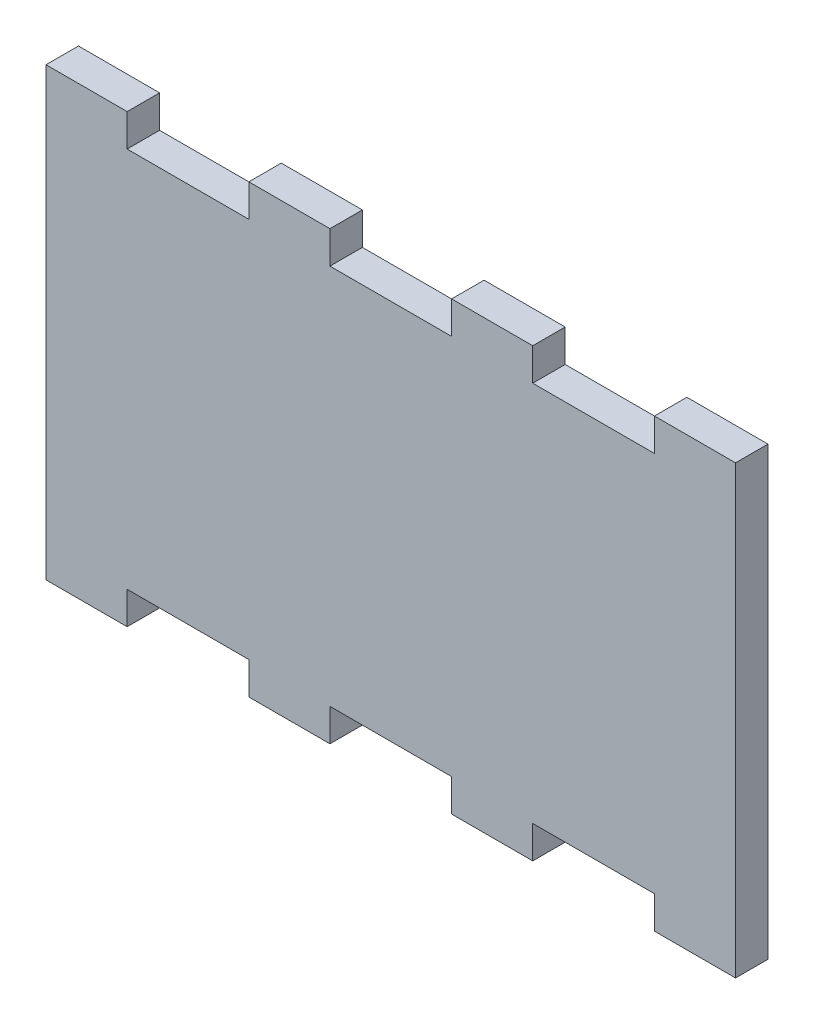
ISO-10303-21;
HEADER;
FILE_DESCRIPTION(('STEP AP214'),'2;1');
FILE_NAME('part.step','',(''),(''),'','','');
FILE_SCHEMA(('AUTOMOTIVE_DESIGN { 1 0 10303 214 1 1 1 1 }'));
ENDSEC;
DATA;
#1=APPLICATION_CONTEXT('core data for automotive mechanical design processes');
#2=APPLICATION_PROTOCOL_DEFINITION('international standard','automotive_design',2000,#1);
#3=PRODUCT_CONTEXT('',#1,'mechanical');
#4=PRODUCT('Part','Part','',(#3));
#5=PRODUCT_RELATED_PRODUCT_CATEGORY('part','',(#4));
#6=PRODUCT_DEFINITION_FORMATION('','',#4);
#7=PRODUCT_DEFINITION_CONTEXT('part definition',#1,'design');
#8=PRODUCT_DEFINITION('design','',#6,#7);
#9=PRODUCT_DEFINITION_SHAPE('','',#8);
#10=(LENGTH_UNIT() NAMED_UNIT(*) SI_UNIT(.MILLI.,.METRE.));
#11=(NAMED_UNIT(*) PLANE_ANGLE_UNIT() SI_UNIT($,.RADIAN.));
#12=(NAMED_UNIT(*) SI_UNIT($,.STERADIAN.) SOLID_ANGLE_UNIT());
#13=UNCERTAINTY_MEASURE_WITH_UNIT(LENGTH_MEASURE(1.E-05),#10,'distance_accuracy_value','');
#14=(GEOMETRIC_REPRESENTATION_CONTEXT(3) GLOBAL_UNCERTAINTY_ASSIGNED_CONTEXT((#13)) GLOBAL_UNIT_ASSIGNED_CONTEXT((#10,
#11,#12)) REPRESENTATION_CONTEXT('',''));
#15=CARTESIAN_POINT('',(0.,0.,0.));
#16=DIRECTION('',(0.,0.,1.));
#17=DIRECTION('',(1.,0.,0.));
#18=AXIS2_PLACEMENT_3D('',#15,#16,#17);
#19=CARTESIAN_POINT('',(0.,0.,4.));
#20=DIRECTION('',(1.,0.,0.));
#21=DIRECTION('',(0.,1.,0.));
#22=AXIS2_PLACEMENT_3D('',#19,#20,#21);
#23=PLANE('',#22);
#24=DIRECTION('',(0.,-1.,0.));
#25=VECTOR('',#24,1.);
#26=CARTESIAN_POINT('',(0.,0.,0.));
#27=LINE('',#26,#25);
#28=CARTESIAN_POINT('',(0.,55.,0.));
#29=VERTEX_POINT('',#28);
#30=CARTESIAN_POINT('',(0.,0.,0.));
#31=VERTEX_POINT('',#30);
#32=EDGE_CURVE('E252',#29,#31,#27,.T.);
#33=ORIENTED_EDGE('',*,*,#32,.T.);
#34=DIRECTION('',(0.,0.,-1.));
#35=VECTOR('',#34,1.);
#36=CARTESIAN_POINT('',(0.,0.,4.));
#37=LINE('',#36,#35);
#38=CARTESIAN_POINT('',(0.,0.,4.));
#39=VERTEX_POINT('',#38);
#40=EDGE_CURVE('E11',#39,#31,#37,.T.);
#41=ORIENTED_EDGE('',*,*,#40,.F.);
#42=DIRECTION('',(0.,-1.,0.));
#43=VECTOR('',#42,1.);
#44=CARTESIAN_POINT('',(0.,0.,4.));
#45=LINE('',#44,#43);
#46=CARTESIAN_POINT('',(0.,55.,4.));
#47=VERTEX_POINT('',#46);
#48=EDGE_CURVE('E306',#47,#39,#45,.T.);
#49=ORIENTED_EDGE('',*,*,#48,.F.);
#50=DIRECTION('',(0.,0.,-1.));
#51=VECTOR('',#50,1.);
#52=CARTESIAN_POINT('',(0.,55.,4.));
#53=LINE('',#52,#51);
#54=EDGE_CURVE('E248',#47,#29,#53,.T.);
#55=ORIENTED_EDGE('',*,*,#54,.T.);
#56=EDGE_LOOP('',(#33,#41,#49,#55));
#57=FACE_BOUND('',#56,.T.);
#58=ADVANCED_FACE('F36',(#57),#23,.F.);
#59=CARTESIAN_POINT('',(0.,0.,4.));
#60=DIRECTION('',(0.,1.,0.));
#61=DIRECTION('',(0.,0.,1.));
#62=AXIS2_PLACEMENT_3D('',#59,#60,#61);
#63=PLANE('',#62);
#64=DIRECTION('',(1.,0.,0.));
#65=VECTOR('',#64,1.);
#66=CARTESIAN_POINT('',(0.,0.,0.));
#67=LINE('',#66,#65);
#68=CARTESIAN_POINT('',(10.,0.,0.));
#69=VERTEX_POINT('',#68);
#70=EDGE_CURVE('E255',#31,#69,#67,.T.);
#71=ORIENTED_EDGE('',*,*,#70,.T.);
#72=DIRECTION('',(0.,0.,-1.));
#73=VECTOR('',#72,1.);
#74=CARTESIAN_POINT('',(10.,0.,4.));
#75=LINE('',#74,#73);
#76=CARTESIAN_POINT('',(10.,0.,4.));
#77=VERTEX_POINT('',#76);
#78=EDGE_CURVE('E44',#77,#69,#75,.T.);
#79=ORIENTED_EDGE('',*,*,#78,.F.);
#80=DIRECTION('',(1.,0.,0.));
#81=VECTOR('',#80,1.);
#82=CARTESIAN_POINT('',(0.,0.,4.));
#83=LINE('',#82,#81);
#84=EDGE_CURVE('E155',#39,#77,#83,.T.);
#85=ORIENTED_EDGE('',*,*,#84,.F.);
#86=ORIENTED_EDGE('',*,*,#40,.T.);
#87=EDGE_LOOP('',(#71,#79,#85,#86));
#88=FACE_BOUND('',#87,.T.);
#89=ADVANCED_FACE('F464',(#88),#63,.F.);
#90=CARTESIAN_POINT('',(10.,0.,4.));
#91=DIRECTION('',(-1.,0.,0.));
#92=DIRECTION('',(0.,-1.,0.));
#93=AXIS2_PLACEMENT_3D('',#90,#91,#92);
#94=PLANE('',#93);
#95=DIRECTION('',(0.,1.,0.));
#96=VECTOR('',#95,1.);
#97=CARTESIAN_POINT('',(10.,0.,0.));
#98=LINE('',#97,#96);
#99=CARTESIAN_POINT('',(10.,4.,0.));
#100=VERTEX_POINT('',#99);
#101=EDGE_CURVE('E257',#69,#100,#98,.T.);
#102=ORIENTED_EDGE('',*,*,#101,.T.);
#103=DIRECTION('',(0.,0.,-1.));
#104=VECTOR('',#103,1.);
#105=CARTESIAN_POINT('',(10.,4.,4.));
#106=LINE('',#105,#104);
#107=CARTESIAN_POINT('',(10.,4.,4.));
#108=VERTEX_POINT('',#107);
#109=EDGE_CURVE('E373',#108,#100,#106,.T.);
#110=ORIENTED_EDGE('',*,*,#109,.F.);
#111=DIRECTION('',(0.,1.,0.));
#112=VECTOR('',#111,1.);
#113=CARTESIAN_POINT('',(10.,0.,4.));
#114=LINE('',#113,#112);
#115=EDGE_CURVE('E381',#77,#108,#114,.T.);
#116=ORIENTED_EDGE('',*,*,#115,.F.);
#117=ORIENTED_EDGE('',*,*,#78,.T.);
#118=EDGE_LOOP('',(#102,#110,#116,#117));
#119=FACE_BOUND('',#118,.T.);
#120=ADVANCED_FACE('F379',(#119),#94,.F.);
#121=CARTESIAN_POINT('',(10.,4.,4.));
#122=DIRECTION('',(0.,1.,0.));
#123=DIRECTION('',(0.,0.,1.));
#124=AXIS2_PLACEMENT_3D('',#121,#122,#123);
#125=PLANE('',#124);
#126=DIRECTION('',(1.,0.,0.));
#127=VECTOR('',#126,1.);
#128=CARTESIAN_POINT('',(10.,4.,0.));
#129=LINE('',#128,#127);
#130=CARTESIAN_POINT('',(25.,4.,0.));
#131=VERTEX_POINT('',#130);
#132=EDGE_CURVE('E259',#100,#131,#129,.T.);
#133=ORIENTED_EDGE('',*,*,#132,.T.);
#134=DIRECTION('',(0.,0.,-1.));
#135=VECTOR('',#134,1.);
#136=CARTESIAN_POINT('',(25.,4.,4.));
#137=LINE('',#136,#135);
#138=CARTESIAN_POINT('',(25.,4.,4.));
#139=VERTEX_POINT('',#138);
#140=EDGE_CURVE('E370',#139,#131,#137,.T.);
#141=ORIENTED_EDGE('',*,*,#140,.F.);
#142=DIRECTION('',(1.,0.,0.));
#143=VECTOR('',#142,1.);
#144=CARTESIAN_POINT('',(10.,4.,4.));
#145=LINE('',#144,#143);
#146=EDGE_CURVE('E399',#108,#139,#145,.T.);
#147=ORIENTED_EDGE('',*,*,#146,.F.);
#148=ORIENTED_EDGE('',*,*,#109,.T.);
#149=EDGE_LOOP('',(#133,#141,#147,#148));
#150=FACE_BOUND('',#149,.T.);
#151=ADVANCED_FACE('F390',(#150),#125,.F.);
#152=CARTESIAN_POINT('',(25.,4.,4.));
#153=DIRECTION('',(1.,0.,0.));
#154=DIRECTION('',(0.,0.,-1.));
#155=AXIS2_PLACEMENT_3D('',#152,#153,#154);
#156=PLANE('',#155);
#157=DIRECTION('',(0.,-1.,0.));
#158=VECTOR('',#157,1.);
#159=CARTESIAN_POINT('',(25.,4.,0.));
#160=LINE('',#159,#158);
#161=CARTESIAN_POINT('',(25.,0.,0.));
#162=VERTEX_POINT('',#161);
#163=EDGE_CURVE('E261',#131,#162,#160,.T.);
#164=ORIENTED_EDGE('',*,*,#163,.T.);
#165=DIRECTION('',(0.,0.,-1.));
#166=VECTOR('',#165,1.);
#167=CARTESIAN_POINT('',(25.,0.,4.));
#168=LINE('',#167,#166);
#169=CARTESIAN_POINT('',(25.,0.,4.));
#170=VERTEX_POINT('',#169);
#171=EDGE_CURVE('E367',#170,#162,#168,.T.);
#172=ORIENTED_EDGE('',*,*,#171,.F.);
#173=DIRECTION('',(0.,-1.,0.));
#174=VECTOR('',#173,1.);
#175=CARTESIAN_POINT('',(25.,4.,4.));
#176=LINE('',#175,#174);
#177=EDGE_CURVE('E396',#139,#170,#176,.T.);
#178=ORIENTED_EDGE('',*,*,#177,.F.);
#179=ORIENTED_EDGE('',*,*,#140,.T.);
#180=EDGE_LOOP('',(#164,#172,#178,#179));
#181=FACE_BOUND('',#180,.T.);
#182=ADVANCED_FACE('F394',(#181),#156,.F.);
#183=CARTESIAN_POINT('',(25.,0.,4.));
#184=DIRECTION('',(0.,1.,0.));
#185=DIRECTION('',(-1.,0.,0.));
#186=AXIS2_PLACEMENT_3D('',#183,#184,#185);
#187=PLANE('',#186);
#188=DIRECTION('',(1.,0.,0.));
#189=VECTOR('',#188,1.);
#190=CARTESIAN_POINT('',(25.,0.,0.));
#191=LINE('',#190,#189);
#192=CARTESIAN_POINT('',(35.,0.,0.));
#193=VERTEX_POINT('',#192);
#194=EDGE_CURVE('E263',#162,#193,#191,.T.);
#195=ORIENTED_EDGE('',*,*,#194,.T.);
#196=DIRECTION('',(0.,0.,-1.));
#197=VECTOR('',#196,1.);
#198=CARTESIAN_POINT('',(35.,0.,4.));
#199=LINE('',#198,#197);
#200=CARTESIAN_POINT('',(35.,0.,4.));
#201=VERTEX_POINT('',#200);
#202=EDGE_CURVE('E364',#201,#193,#199,.T.);
#203=ORIENTED_EDGE('',*,*,#202,.F.);
#204=DIRECTION('',(1.,0.,0.));
#205=VECTOR('',#204,1.);
#206=CARTESIAN_POINT('',(25.,0.,4.));
#207=LINE('',#206,#205);
#208=EDGE_CURVE('E398',#170,#201,#207,.T.);
#209=ORIENTED_EDGE('',*,*,#208,.F.);
#210=ORIENTED_EDGE('',*,*,#171,.T.);
#211=EDGE_LOOP('',(#195,#203,#209,#210));
#212=FACE_BOUND('',#211,.T.);
#213=ADVANCED_FACE('F477',(#212),#187,.F.);
#214=CARTESIAN_POINT('',(35.,0.,4.));
#215=DIRECTION('',(-1.,0.,0.));
#216=DIRECTION('',(0.,0.,1.));
#217=AXIS2_PLACEMENT_3D('',#214,#215,#216);
#218=PLANE('',#217);
#219=DIRECTION('',(0.,1.,0.));
#220=VECTOR('',#219,1.);
#221=CARTESIAN_POINT('',(35.,0.,0.));
#222=LINE('',#221,#220);
#223=CARTESIAN_POINT('',(35.,3.99999999999999,0.));
#224=VERTEX_POINT('',#223);
#225=EDGE_CURVE('E265',#193,#224,#222,.T.);
#226=ORIENTED_EDGE('',*,*,#225,.T.);
#227=DIRECTION('',(0.,0.,-1.));
#228=VECTOR('',#227,1.);
#229=CARTESIAN_POINT('',(35.,3.99999999999999,4.));
#230=LINE('',#229,#228);
#231=CARTESIAN_POINT('',(35.,3.99999999999999,4.));
#232=VERTEX_POINT('',#231);
#233=EDGE_CURVE('E361',#232,#224,#230,.T.);
#234=ORIENTED_EDGE('',*,*,#233,.F.);
#235=DIRECTION('',(0.,1.,0.));
#236=VECTOR('',#235,1.);
#237=CARTESIAN_POINT('',(35.,0.,4.));
#238=LINE('',#237,#236);
#239=EDGE_CURVE('E401',#201,#232,#238,.T.);
#240=ORIENTED_EDGE('',*,*,#239,.F.);
#241=ORIENTED_EDGE('',*,*,#202,.T.);
#242=EDGE_LOOP('',(#226,#234,#240,#241));
#243=FACE_BOUND('',#242,.T.);
#244=ADVANCED_FACE('F480',(#243),#218,.F.);
#245=CARTESIAN_POINT('',(35.,3.99999999999999,4.));
#246=DIRECTION('',(0.,1.,0.));
#247=DIRECTION('',(-1.,0.,0.));
#248=AXIS2_PLACEMENT_3D('',#245,#246,#247);
#249=PLANE('',#248);
#250=DIRECTION('',(1.,0.,0.));
#251=VECTOR('',#250,1.);
#252=CARTESIAN_POINT('',(35.,3.99999999999999,0.));
#253=LINE('',#252,#251);
#254=CARTESIAN_POINT('',(50.,3.99999999999999,0.));
#255=VERTEX_POINT('',#254);
#256=EDGE_CURVE('E267',#224,#255,#253,.T.);
#257=ORIENTED_EDGE('',*,*,#256,.T.);
#258=DIRECTION('',(0.,0.,-1.));
#259=VECTOR('',#258,1.);
#260=CARTESIAN_POINT('',(50.,3.99999999999999,4.));
#261=LINE('',#260,#259);
#262=CARTESIAN_POINT('',(50.,3.99999999999999,4.));
#263=VERTEX_POINT('',#262);
#264=EDGE_CURVE('E358',#263,#255,#261,.T.);
#265=ORIENTED_EDGE('',*,*,#264,.F.);
#266=DIRECTION('',(1.,0.,0.));
#267=VECTOR('',#266,1.);
#268=CARTESIAN_POINT('',(35.,3.99999999999999,4.));
#269=LINE('',#268,#267);
#270=EDGE_CURVE('E407',#232,#263,#269,.T.);
#271=ORIENTED_EDGE('',*,*,#270,.F.);
#272=ORIENTED_EDGE('',*,*,#233,.T.);
#273=EDGE_LOOP('',(#257,#265,#271,#272));
#274=FACE_BOUND('',#273,.T.);
#275=ADVANCED_FACE('F484',(#274),#249,.F.);
#276=CARTESIAN_POINT('',(50.,3.99999999999999,4.));
#277=DIRECTION('',(1.,0.,0.));
#278=DIRECTION('',(0.,0.,-1.));
#279=AXIS2_PLACEMENT_3D('',#276,#277,#278);
#280=PLANE('',#279);
#281=DIRECTION('',(0.,-1.,0.));
#282=VECTOR('',#281,1.);
#283=CARTESIAN_POINT('',(50.,3.99999999999999,0.));
#284=LINE('',#283,#282);
#285=CARTESIAN_POINT('',(50.,0.,0.));
#286=VERTEX_POINT('',#285);
#287=EDGE_CURVE('E269',#255,#286,#284,.T.);
#288=ORIENTED_EDGE('',*,*,#287,.T.);
#289=DIRECTION('',(0.,0.,-1.));
#290=VECTOR('',#289,1.);
#291=CARTESIAN_POINT('',(50.,0.,4.));
#292=LINE('',#291,#290);
#293=CARTESIAN_POINT('',(50.,0.,4.));
#294=VERTEX_POINT('',#293);
#295=EDGE_CURVE('E355',#294,#286,#292,.T.);
#296=ORIENTED_EDGE('',*,*,#295,.F.);
#297=DIRECTION('',(0.,-1.,0.));
#298=VECTOR('',#297,1.);
#299=CARTESIAN_POINT('',(50.,3.99999999999999,4.));
#300=LINE('',#299,#298);
#301=EDGE_CURVE('E409',#263,#294,#300,.T.);
#302=ORIENTED_EDGE('',*,*,#301,.F.);
#303=ORIENTED_EDGE('',*,*,#264,.T.);
#304=EDGE_LOOP('',(#288,#296,#302,#303));
#305=FACE_BOUND('',#304,.T.);
#306=ADVANCED_FACE('F488',(#305),#280,.F.);
#307=CARTESIAN_POINT('',(50.,0.,4.));
#308=DIRECTION('',(0.,1.,0.));
#309=DIRECTION('',(0.,0.,1.));
#310=AXIS2_PLACEMENT_3D('',#307,#308,#309);
#311=PLANE('',#310);
#312=DIRECTION('',(1.,0.,0.));
#313=VECTOR('',#312,1.);
#314=CARTESIAN_POINT('',(50.,0.,0.));
#315=LINE('',#314,#313);
#316=CARTESIAN_POINT('',(60.,0.,0.));
#317=VERTEX_POINT('',#316);
#318=EDGE_CURVE('E271',#286,#317,#315,.T.);
#319=ORIENTED_EDGE('',*,*,#318,.T.);
#320=DIRECTION('',(0.,0.,-1.));
#321=VECTOR('',#320,1.);
#322=CARTESIAN_POINT('',(60.,0.,4.));
#323=LINE('',#322,#321);
#324=CARTESIAN_POINT('',(60.,0.,4.));
#325=VERTEX_POINT('',#324);
#326=EDGE_CURVE('E352',#325,#317,#323,.T.);
#327=ORIENTED_EDGE('',*,*,#326,.F.);
#328=DIRECTION('',(1.,0.,0.));
#329=VECTOR('',#328,1.);
#330=CARTESIAN_POINT('',(50.,0.,4.));
#331=LINE('',#330,#329);
#332=EDGE_CURVE('E411',#294,#325,#331,.T.);
#333=ORIENTED_EDGE('',*,*,#332,.F.);
#334=ORIENTED_EDGE('',*,*,#295,.T.);
#335=EDGE_LOOP('',(#319,#327,#333,#334));
#336=FACE_BOUND('',#335,.T.);
#337=ADVANCED_FACE('F492',(#336),#311,.F.);
#338=CARTESIAN_POINT('',(60.,0.,4.));
#339=DIRECTION('',(-1.,0.,0.));
#340=DIRECTION('',(0.,0.,1.));
#341=AXIS2_PLACEMENT_3D('',#338,#339,#340);
#342=PLANE('',#341);
#343=DIRECTION('',(0.,1.,0.));
#344=VECTOR('',#343,1.);
#345=CARTESIAN_POINT('',(60.,0.,0.));
#346=LINE('',#345,#344);
#347=CARTESIAN_POINT('',(60.,3.99999999999999,0.));
#348=VERTEX_POINT('',#347);
#349=EDGE_CURVE('E273',#317,#348,#346,.T.);
#350=ORIENTED_EDGE('',*,*,#349,.T.);
#351=DIRECTION('',(0.,0.,-1.));
#352=VECTOR('',#351,1.);
#353=CARTESIAN_POINT('',(60.,3.99999999999999,4.));
#354=LINE('',#353,#352);
#355=CARTESIAN_POINT('',(60.,3.99999999999999,4.));
#356=VERTEX_POINT('',#355);
#357=EDGE_CURVE('E349',#356,#348,#354,.T.);
#358=ORIENTED_EDGE('',*,*,#357,.F.);
#359=DIRECTION('',(0.,1.,0.));
#360=VECTOR('',#359,1.);
#361=CARTESIAN_POINT('',(60.,0.,4.));
#362=LINE('',#361,#360);
#363=EDGE_CURVE('E413',#325,#356,#362,.T.);
#364=ORIENTED_EDGE('',*,*,#363,.F.);
#365=ORIENTED_EDGE('',*,*,#326,.T.);
#366=EDGE_LOOP('',(#350,#358,#364,#365));
#367=FACE_BOUND('',#366,.T.);
#368=ADVANCED_FACE('F496',(#367),#342,.F.);
#369=CARTESIAN_POINT('',(60.,3.99999999999999,4.));
#370=DIRECTION('',(0.,1.,0.));
#371=DIRECTION('',(0.,0.,1.));
#372=AXIS2_PLACEMENT_3D('',#369,#370,#371);
#373=PLANE('',#372);
#374=DIRECTION('',(1.,0.,0.));
#375=VECTOR('',#374,1.);
#376=CARTESIAN_POINT('',(60.,3.99999999999999,0.));
#377=LINE('',#376,#375);
#378=CARTESIAN_POINT('',(75.,3.99999999999999,0.));
#379=VERTEX_POINT('',#378);
#380=EDGE_CURVE('E275',#348,#379,#377,.T.);
#381=ORIENTED_EDGE('',*,*,#380,.T.);
#382=DIRECTION('',(0.,0.,-1.));
#383=VECTOR('',#382,1.);
#384=CARTESIAN_POINT('',(75.,3.99999999999999,4.));
#385=LINE('',#384,#383);
#386=CARTESIAN_POINT('',(75.,3.99999999999999,4.));
#387=VERTEX_POINT('',#386);
#388=EDGE_CURVE('E346',#387,#379,#385,.T.);
#389=ORIENTED_EDGE('',*,*,#388,.F.);
#390=DIRECTION('',(1.,0.,0.));
#391=VECTOR('',#390,1.);
#392=CARTESIAN_POINT('',(60.,3.99999999999999,4.));
#393=LINE('',#392,#391);
#394=EDGE_CURVE('E415',#356,#387,#393,.T.);
#395=ORIENTED_EDGE('',*,*,#394,.F.);
#396=ORIENTED_EDGE('',*,*,#357,.T.);
#397=EDGE_LOOP('',(#381,#389,#395,#396));
#398=FACE_BOUND('',#397,.T.);
#399=ADVANCED_FACE('F500',(#398),#373,.F.);
#400=CARTESIAN_POINT('',(75.,3.99999999999999,4.));
#401=DIRECTION('',(1.,0.,0.));
#402=DIRECTION('',(0.,0.,-1.));
#403=AXIS2_PLACEMENT_3D('',#400,#401,#402);
#404=PLANE('',#403);
#405=DIRECTION('',(0.,-1.,0.));
#406=VECTOR('',#405,1.);
#407=CARTESIAN_POINT('',(75.,3.99999999999999,0.));
#408=LINE('',#407,#406);
#409=CARTESIAN_POINT('',(75.,0.,0.));
#410=VERTEX_POINT('',#409);
#411=EDGE_CURVE('E277',#379,#410,#408,.T.);
#412=ORIENTED_EDGE('',*,*,#411,.T.);
#413=DIRECTION('',(0.,0.,-1.));
#414=VECTOR('',#413,1.);
#415=CARTESIAN_POINT('',(75.,0.,4.));
#416=LINE('',#415,#414);
#417=CARTESIAN_POINT('',(75.,0.,4.));
#418=VERTEX_POINT('',#417);
#419=EDGE_CURVE('E343',#418,#410,#416,.T.);
#420=ORIENTED_EDGE('',*,*,#419,.F.);
#421=DIRECTION('',(0.,-1.,0.));
#422=VECTOR('',#421,1.);
#423=CARTESIAN_POINT('',(75.,3.99999999999999,4.));
#424=LINE('',#423,#422);
#425=EDGE_CURVE('E417',#387,#418,#424,.T.);
#426=ORIENTED_EDGE('',*,*,#425,.F.);
#427=ORIENTED_EDGE('',*,*,#388,.T.);
#428=EDGE_LOOP('',(#412,#420,#426,#427));
#429=FACE_BOUND('',#428,.T.);
#430=ADVANCED_FACE('F504',(#429),#404,.F.);
#431=CARTESIAN_POINT('',(75.,0.,4.));
#432=DIRECTION('',(0.,1.,0.));
#433=DIRECTION('',(0.,0.,1.));
#434=AXIS2_PLACEMENT_3D('',#431,#432,#433);
#435=PLANE('',#434);
#436=DIRECTION('',(1.,0.,0.));
#437=VECTOR('',#436,1.);
#438=CARTESIAN_POINT('',(75.,0.,0.));
#439=LINE('',#438,#437);
#440=CARTESIAN_POINT('',(85.,0.,0.));
#441=VERTEX_POINT('',#440);
#442=EDGE_CURVE('E279',#410,#441,#439,.T.);
#443=ORIENTED_EDGE('',*,*,#442,.T.);
#444=DIRECTION('',(0.,0.,-1.));
#445=VECTOR('',#444,1.);
#446=CARTESIAN_POINT('',(85.,0.,4.));
#447=LINE('',#446,#445);
#448=CARTESIAN_POINT('',(85.,0.,4.));
#449=VERTEX_POINT('',#448);
#450=EDGE_CURVE('E340',#449,#441,#447,.T.);
#451=ORIENTED_EDGE('',*,*,#450,.F.);
#452=DIRECTION('',(1.,0.,0.));
#453=VECTOR('',#452,1.);
#454=CARTESIAN_POINT('',(75.,0.,4.));
#455=LINE('',#454,#453);
#456=EDGE_CURVE('E419',#418,#449,#455,.T.);
#457=ORIENTED_EDGE('',*,*,#456,.F.);
#458=ORIENTED_EDGE('',*,*,#419,.T.);
#459=EDGE_LOOP('',(#443,#451,#457,#458));
#460=FACE_BOUND('',#459,.T.);
#461=ADVANCED_FACE('F508',(#460),#435,.F.);
#462=CARTESIAN_POINT('',(85.,0.,4.));
#463=DIRECTION('',(-1.,0.,0.));
#464=DIRECTION('',(0.,-1.,0.));
#465=AXIS2_PLACEMENT_3D('',#462,#463,#464);
#466=PLANE('',#465);
#467=DIRECTION('',(0.,1.,0.));
#468=VECTOR('',#467,1.);
#469=CARTESIAN_POINT('',(85.,0.,0.));
#470=LINE('',#469,#468);
#471=CARTESIAN_POINT('',(85.,55.,0.));
#472=VERTEX_POINT('',#471);
#473=EDGE_CURVE('E281',#441,#472,#470,.T.);
#474=ORIENTED_EDGE('',*,*,#473,.T.);
#475=DIRECTION('',(0.,0.,-1.));
#476=VECTOR('',#475,1.);
#477=CARTESIAN_POINT('',(85.,55.,4.));
#478=LINE('',#477,#476);
#479=CARTESIAN_POINT('',(85.,55.,4.));
#480=VERTEX_POINT('',#479);
#481=EDGE_CURVE('E337',#480,#472,#478,.T.);
#482=ORIENTED_EDGE('',*,*,#481,.F.);
#483=DIRECTION('',(0.,1.,0.));
#484=VECTOR('',#483,1.);
#485=CARTESIAN_POINT('',(85.,0.,4.));
#486=LINE('',#485,#484);
#487=EDGE_CURVE('E421',#449,#480,#486,.T.);
#488=ORIENTED_EDGE('',*,*,#487,.F.);
#489=ORIENTED_EDGE('',*,*,#450,.T.);
#490=EDGE_LOOP('',(#474,#482,#488,#489));
#491=FACE_BOUND('',#490,.T.);
#492=ADVANCED_FACE('F512',(#491),#466,.F.);
#493=CARTESIAN_POINT('',(75.,55.,4.));
#494=DIRECTION('',(0.,-1.,0.));
#495=DIRECTION('',(0.,0.,-1.));
#496=AXIS2_PLACEMENT_3D('',#493,#494,#495);
#497=PLANE('',#496);
#498=DIRECTION('',(-1.,0.,0.));
#499=VECTOR('',#498,1.);
#500=CARTESIAN_POINT('',(75.,55.,0.));
#501=LINE('',#500,#499);
#502=CARTESIAN_POINT('',(75.,55.,0.));
#503=VERTEX_POINT('',#502);
#504=EDGE_CURVE('E283',#472,#503,#501,.T.);
#505=ORIENTED_EDGE('',*,*,#504,.T.);
#506=DIRECTION('',(0.,0.,-1.));
#507=VECTOR('',#506,1.);
#508=CARTESIAN_POINT('',(75.,55.,4.));
#509=LINE('',#508,#507);
#510=CARTESIAN_POINT('',(75.,55.,4.));
#511=VERTEX_POINT('',#510);
#512=EDGE_CURVE('E334',#511,#503,#509,.T.);
#513=ORIENTED_EDGE('',*,*,#512,.F.);
#514=DIRECTION('',(-1.,0.,0.));
#515=VECTOR('',#514,1.);
#516=CARTESIAN_POINT('',(75.,55.,4.));
#517=LINE('',#516,#515);
#518=EDGE_CURVE('E423',#480,#511,#517,.T.);
#519=ORIENTED_EDGE('',*,*,#518,.F.);
#520=ORIENTED_EDGE('',*,*,#481,.T.);
#521=EDGE_LOOP('',(#505,#513,#519,#520));
#522=FACE_BOUND('',#521,.T.);
#523=ADVANCED_FACE('F516',(#522),#497,.F.);
#524=CARTESIAN_POINT('',(75.,51.,4.));
#525=DIRECTION('',(1.,0.,0.));
#526=DIRECTION('',(0.,0.,-1.));
#527=AXIS2_PLACEMENT_3D('',#524,#525,#526);
#528=PLANE('',#527);
#529=DIRECTION('',(0.,-1.,0.));
#530=VECTOR('',#529,1.);
#531=CARTESIAN_POINT('',(75.,51.,0.));
#532=LINE('',#531,#530);
#533=CARTESIAN_POINT('',(75.,51.,0.));
#534=VERTEX_POINT('',#533);
#535=EDGE_CURVE('E285',#503,#534,#532,.T.);
#536=ORIENTED_EDGE('',*,*,#535,.T.);
#537=DIRECTION('',(0.,0.,-1.));
#538=VECTOR('',#537,1.);
#539=CARTESIAN_POINT('',(75.,51.,4.));
#540=LINE('',#539,#538);
#541=CARTESIAN_POINT('',(75.,51.,4.));
#542=VERTEX_POINT('',#541);
#543=EDGE_CURVE('E331',#542,#534,#540,.T.);
#544=ORIENTED_EDGE('',*,*,#543,.F.);
#545=DIRECTION('',(0.,-1.,0.));
#546=VECTOR('',#545,1.);
#547=CARTESIAN_POINT('',(75.,51.,4.));
#548=LINE('',#547,#546);
#549=EDGE_CURVE('E425',#511,#542,#548,.T.);
#550=ORIENTED_EDGE('',*,*,#549,.F.);
#551=ORIENTED_EDGE('',*,*,#512,.T.);
#552=EDGE_LOOP('',(#536,#544,#550,#551));
#553=FACE_BOUND('',#552,.T.);
#554=ADVANCED_FACE('F520',(#553),#528,.F.);
#555=CARTESIAN_POINT('',(60.,51.,4.));
#556=DIRECTION('',(0.,-1.,0.));
#557=DIRECTION('',(1.,0.,0.));
#558=AXIS2_PLACEMENT_3D('',#555,#556,#557);
#559=PLANE('',#558);
#560=DIRECTION('',(-1.,0.,0.));
#561=VECTOR('',#560,1.);
#562=CARTESIAN_POINT('',(60.,51.,0.));
#563=LINE('',#562,#561);
#564=CARTESIAN_POINT('',(60.,51.,0.));
#565=VERTEX_POINT('',#564);
#566=EDGE_CURVE('E287',#534,#565,#563,.T.);
#567=ORIENTED_EDGE('',*,*,#566,.T.);
#568=DIRECTION('',(0.,0.,-1.));
#569=VECTOR('',#568,1.);
#570=CARTESIAN_POINT('',(60.,51.,4.));
#571=LINE('',#570,#569);
#572=CARTESIAN_POINT('',(60.,51.,4.));
#573=VERTEX_POINT('',#572);
#574=EDGE_CURVE('E328',#573,#565,#571,.T.);
#575=ORIENTED_EDGE('',*,*,#574,.F.);
#576=DIRECTION('',(-1.,0.,0.));
#577=VECTOR('',#576,1.);
#578=CARTESIAN_POINT('',(60.,51.,4.));
#579=LINE('',#578,#577);
#580=EDGE_CURVE('E427',#542,#573,#579,.T.);
#581=ORIENTED_EDGE('',*,*,#580,.F.);
#582=ORIENTED_EDGE('',*,*,#543,.T.);
#583=EDGE_LOOP('',(#567,#575,#581,#582));
#584=FACE_BOUND('',#583,.T.);
#585=ADVANCED_FACE('F524',(#584),#559,.F.);
#586=CARTESIAN_POINT('',(60.,55.,4.));
#587=DIRECTION('',(-1.,0.,0.));
#588=DIRECTION('',(0.,0.,1.));
#589=AXIS2_PLACEMENT_3D('',#586,#587,#588);
#590=PLANE('',#589);
#591=DIRECTION('',(0.,1.,0.));
#592=VECTOR('',#591,1.);
#593=CARTESIAN_POINT('',(60.,55.,0.));
#594=LINE('',#593,#592);
#595=CARTESIAN_POINT('',(60.,55.,0.));
#596=VERTEX_POINT('',#595);
#597=EDGE_CURVE('E289',#565,#596,#594,.T.);
#598=ORIENTED_EDGE('',*,*,#597,.T.);
#599=DIRECTION('',(0.,0.,-1.));
#600=VECTOR('',#599,1.);
#601=CARTESIAN_POINT('',(60.,55.,4.));
#602=LINE('',#601,#600);
#603=CARTESIAN_POINT('',(60.,55.,4.));
#604=VERTEX_POINT('',#603);
#605=EDGE_CURVE('E325',#604,#596,#602,.T.);
#606=ORIENTED_EDGE('',*,*,#605,.F.);
#607=DIRECTION('',(0.,1.,0.));
#608=VECTOR('',#607,1.);
#609=CARTESIAN_POINT('',(60.,55.,4.));
#610=LINE('',#609,#608);
#611=EDGE_CURVE('E429',#573,#604,#610,.T.);
#612=ORIENTED_EDGE('',*,*,#611,.F.);
#613=ORIENTED_EDGE('',*,*,#574,.T.);
#614=EDGE_LOOP('',(#598,#606,#612,#613));
#615=FACE_BOUND('',#614,.T.);
#616=ADVANCED_FACE('F528',(#615),#590,.F.);
#617=CARTESIAN_POINT('',(50.,55.,4.));
#618=DIRECTION('',(0.,-1.,0.));
#619=DIRECTION('',(0.,0.,-1.));
#620=AXIS2_PLACEMENT_3D('',#617,#618,#619);
#621=PLANE('',#620);
#622=DIRECTION('',(-1.,0.,0.));
#623=VECTOR('',#622,1.);
#624=CARTESIAN_POINT('',(50.,55.,0.));
#625=LINE('',#624,#623);
#626=CARTESIAN_POINT('',(50.,55.,0.));
#627=VERTEX_POINT('',#626);
#628=EDGE_CURVE('E291',#596,#627,#625,.T.);
#629=ORIENTED_EDGE('',*,*,#628,.T.);
#630=DIRECTION('',(0.,0.,-1.));
#631=VECTOR('',#630,1.);
#632=CARTESIAN_POINT('',(50.,55.,4.));
#633=LINE('',#632,#631);
#634=CARTESIAN_POINT('',(50.,55.,4.));
#635=VERTEX_POINT('',#634);
#636=EDGE_CURVE('E322',#635,#627,#633,.T.);
#637=ORIENTED_EDGE('',*,*,#636,.F.);
#638=DIRECTION('',(-1.,0.,0.));
#639=VECTOR('',#638,1.);
#640=CARTESIAN_POINT('',(50.,55.,4.));
#641=LINE('',#640,#639);
#642=EDGE_CURVE('E431',#604,#635,#641,.T.);
#643=ORIENTED_EDGE('',*,*,#642,.F.);
#644=ORIENTED_EDGE('',*,*,#605,.T.);
#645=EDGE_LOOP('',(#629,#637,#643,#644));
#646=FACE_BOUND('',#645,.T.);
#647=ADVANCED_FACE('F532',(#646),#621,.F.);
#648=CARTESIAN_POINT('',(50.,51.,4.));
#649=DIRECTION('',(1.,0.,0.));
#650=DIRECTION('',(0.,0.,-1.));
#651=AXIS2_PLACEMENT_3D('',#648,#649,#650);
#652=PLANE('',#651);
#653=DIRECTION('',(0.,-1.,0.));
#654=VECTOR('',#653,1.);
#655=CARTESIAN_POINT('',(50.,51.,0.));
#656=LINE('',#655,#654);
#657=CARTESIAN_POINT('',(50.,51.,0.));
#658=VERTEX_POINT('',#657);
#659=EDGE_CURVE('E293',#627,#658,#656,.T.);
#660=ORIENTED_EDGE('',*,*,#659,.T.);
#661=DIRECTION('',(0.,0.,-1.));
#662=VECTOR('',#661,1.);
#663=CARTESIAN_POINT('',(50.,51.,4.));
#664=LINE('',#663,#662);
#665=CARTESIAN_POINT('',(50.,51.,4.));
#666=VERTEX_POINT('',#665);
#667=EDGE_CURVE('E319',#666,#658,#664,.T.);
#668=ORIENTED_EDGE('',*,*,#667,.F.);
#669=DIRECTION('',(0.,-1.,0.));
#670=VECTOR('',#669,1.);
#671=CARTESIAN_POINT('',(50.,51.,4.));
#672=LINE('',#671,#670);
#673=EDGE_CURVE('E433',#635,#666,#672,.T.);
#674=ORIENTED_EDGE('',*,*,#673,.F.);
#675=ORIENTED_EDGE('',*,*,#636,.T.);
#676=EDGE_LOOP('',(#660,#668,#674,#675));
#677=FACE_BOUND('',#676,.T.);
#678=ADVANCED_FACE('F536',(#677),#652,.F.);
#679=CARTESIAN_POINT('',(35.,51.,4.));
#680=DIRECTION('',(0.,-1.,0.));
#681=DIRECTION('',(0.,0.,-1.));
#682=AXIS2_PLACEMENT_3D('',#679,#680,#681);
#683=PLANE('',#682);
#684=DIRECTION('',(-1.,0.,0.));
#685=VECTOR('',#684,1.);
#686=CARTESIAN_POINT('',(35.,51.,0.));
#687=LINE('',#686,#685);
#688=CARTESIAN_POINT('',(35.,51.,0.));
#689=VERTEX_POINT('',#688);
#690=EDGE_CURVE('E295',#658,#689,#687,.T.);
#691=ORIENTED_EDGE('',*,*,#690,.T.);
#692=DIRECTION('',(0.,0.,-1.));
#693=VECTOR('',#692,1.);
#694=CARTESIAN_POINT('',(35.,51.,4.));
#695=LINE('',#694,#693);
#696=CARTESIAN_POINT('',(35.,51.,4.));
#697=VERTEX_POINT('',#696);
#698=EDGE_CURVE('E316',#697,#689,#695,.T.);
#699=ORIENTED_EDGE('',*,*,#698,.F.);
#700=DIRECTION('',(-1.,0.,0.));
#701=VECTOR('',#700,1.);
#702=CARTESIAN_POINT('',(35.,51.,4.));
#703=LINE('',#702,#701);
#704=EDGE_CURVE('E435',#666,#697,#703,.T.);
#705=ORIENTED_EDGE('',*,*,#704,.F.);
#706=ORIENTED_EDGE('',*,*,#667,.T.);
#707=EDGE_LOOP('',(#691,#699,#705,#706));
#708=FACE_BOUND('',#707,.T.);
#709=ADVANCED_FACE('F540',(#708),#683,.F.);
#710=CARTESIAN_POINT('',(35.,55.,4.));
#711=DIRECTION('',(-1.,0.,0.));
#712=DIRECTION('',(0.,0.,1.));
#713=AXIS2_PLACEMENT_3D('',#710,#711,#712);
#714=PLANE('',#713);
#715=DIRECTION('',(0.,1.,0.));
#716=VECTOR('',#715,1.);
#717=CARTESIAN_POINT('',(35.,55.,0.));
#718=LINE('',#717,#716);
#719=CARTESIAN_POINT('',(35.,55.,0.));
#720=VERTEX_POINT('',#719);
#721=EDGE_CURVE('E297',#689,#720,#718,.T.);
#722=ORIENTED_EDGE('',*,*,#721,.T.);
#723=DIRECTION('',(0.,0.,-1.));
#724=VECTOR('',#723,1.);
#725=CARTESIAN_POINT('',(35.,55.,4.));
#726=LINE('',#725,#724);
#727=CARTESIAN_POINT('',(35.,55.,4.));
#728=VERTEX_POINT('',#727);
#729=EDGE_CURVE('E313',#728,#720,#726,.T.);
#730=ORIENTED_EDGE('',*,*,#729,.F.);
#731=DIRECTION('',(0.,1.,0.));
#732=VECTOR('',#731,1.);
#733=CARTESIAN_POINT('',(35.,55.,4.));
#734=LINE('',#733,#732);
#735=EDGE_CURVE('E437',#697,#728,#734,.T.);
#736=ORIENTED_EDGE('',*,*,#735,.F.);
#737=ORIENTED_EDGE('',*,*,#698,.T.);
#738=EDGE_LOOP('',(#722,#730,#736,#737));
#739=FACE_BOUND('',#738,.T.);
#740=ADVANCED_FACE('F544',(#739),#714,.F.);
#741=CARTESIAN_POINT('',(25.,55.,4.));
#742=DIRECTION('',(0.,-1.,0.));
#743=DIRECTION('',(0.,0.,-1.));
#744=AXIS2_PLACEMENT_3D('',#741,#742,#743);
#745=PLANE('',#744);
#746=DIRECTION('',(-1.,0.,0.));
#747=VECTOR('',#746,1.);
#748=CARTESIAN_POINT('',(25.,55.,0.));
#749=LINE('',#748,#747);
#750=CARTESIAN_POINT('',(25.,55.,0.));
#751=VERTEX_POINT('',#750);
#752=EDGE_CURVE('E299',#720,#751,#749,.T.);
#753=ORIENTED_EDGE('',*,*,#752,.T.);
#754=DIRECTION('',(0.,0.,-1.));
#755=VECTOR('',#754,1.);
#756=CARTESIAN_POINT('',(25.,55.,4.));
#757=LINE('',#756,#755);
#758=CARTESIAN_POINT('',(25.,55.,4.));
#759=VERTEX_POINT('',#758);
#760=EDGE_CURVE('E310',#759,#751,#757,.T.);
#761=ORIENTED_EDGE('',*,*,#760,.F.);
#762=DIRECTION('',(-1.,0.,0.));
#763=VECTOR('',#762,1.);
#764=CARTESIAN_POINT('',(25.,55.,4.));
#765=LINE('',#764,#763);
#766=EDGE_CURVE('E439',#728,#759,#765,.T.);
#767=ORIENTED_EDGE('',*,*,#766,.F.);
#768=ORIENTED_EDGE('',*,*,#729,.T.);
#769=EDGE_LOOP('',(#753,#761,#767,#768));
#770=FACE_BOUND('',#769,.T.);
#771=ADVANCED_FACE('F445',(#770),#745,.F.);
#772=CARTESIAN_POINT('',(25.,51.,4.));
#773=DIRECTION('',(1.,0.,0.));
#774=DIRECTION('',(0.,0.,-1.));
#775=AXIS2_PLACEMENT_3D('',#772,#773,#774);
#776=PLANE('',#775);
#777=DIRECTION('',(0.,-1.,0.));
#778=VECTOR('',#777,1.);
#779=CARTESIAN_POINT('',(25.,51.,0.));
#780=LINE('',#779,#778);
#781=CARTESIAN_POINT('',(25.,51.,0.));
#782=VERTEX_POINT('',#781);
#783=EDGE_CURVE('E301',#751,#782,#780,.T.);
#784=ORIENTED_EDGE('',*,*,#783,.T.);
#785=DIRECTION('',(0.,0.,-1.));
#786=VECTOR('',#785,1.);
#787=CARTESIAN_POINT('',(25.,51.,4.));
#788=LINE('',#787,#786);
#789=CARTESIAN_POINT('',(25.,51.,4.));
#790=VERTEX_POINT('',#789);
#791=EDGE_CURVE('E243',#790,#782,#788,.T.);
#792=ORIENTED_EDGE('',*,*,#791,.F.);
#793=DIRECTION('',(0.,-1.,0.));
#794=VECTOR('',#793,1.);
#795=CARTESIAN_POINT('',(25.,51.,4.));
#796=LINE('',#795,#794);
#797=EDGE_CURVE('E234',#759,#790,#796,.T.);
#798=ORIENTED_EDGE('',*,*,#797,.F.);
#799=ORIENTED_EDGE('',*,*,#760,.T.);
#800=EDGE_LOOP('',(#784,#792,#798,#799));
#801=FACE_BOUND('',#800,.T.);
#802=ADVANCED_FACE('F449',(#801),#776,.F.);
#803=CARTESIAN_POINT('',(9.99999999999999,51.,4.));
#804=DIRECTION('',(0.,-1.,0.));
#805=DIRECTION('',(1.,0.,0.));
#806=AXIS2_PLACEMENT_3D('',#803,#804,#805);
#807=PLANE('',#806);
#808=DIRECTION('',(-1.,0.,0.));
#809=VECTOR('',#808,1.);
#810=CARTESIAN_POINT('',(9.99999999999999,51.,0.));
#811=LINE('',#810,#809);
#812=CARTESIAN_POINT('',(9.99999999999999,51.,0.));
#813=VERTEX_POINT('',#812);
#814=EDGE_CURVE('E242',#782,#813,#811,.T.);
#815=ORIENTED_EDGE('',*,*,#814,.T.);
#816=DIRECTION('',(0.,0.,-1.));
#817=VECTOR('',#816,1.);
#818=CARTESIAN_POINT('',(9.99999999999999,51.,4.));
#819=LINE('',#818,#817);
#820=CARTESIAN_POINT('',(9.99999999999999,51.,4.));
#821=VERTEX_POINT('',#820);
#822=EDGE_CURVE('E239',#821,#813,#819,.T.);
#823=ORIENTED_EDGE('',*,*,#822,.F.);
#824=DIRECTION('',(-1.,0.,0.));
#825=VECTOR('',#824,1.);
#826=CARTESIAN_POINT('',(9.99999999999999,51.,4.));
#827=LINE('',#826,#825);
#828=EDGE_CURVE('E228',#790,#821,#827,.T.);
#829=ORIENTED_EDGE('',*,*,#828,.F.);
#830=ORIENTED_EDGE('',*,*,#791,.T.);
#831=EDGE_LOOP('',(#815,#823,#829,#830));
#832=FACE_BOUND('',#831,.T.);
#833=ADVANCED_FACE('F240',(#832),#807,.F.);
#834=CARTESIAN_POINT('',(9.99999999999999,55.,4.));
#835=DIRECTION('',(-1.,0.,0.));
#836=DIRECTION('',(0.,0.,1.));
#837=AXIS2_PLACEMENT_3D('',#834,#835,#836);
#838=PLANE('',#837);
#839=DIRECTION('',(0.,1.,0.));
#840=VECTOR('',#839,1.);
#841=CARTESIAN_POINT('',(9.99999999999999,55.,0.));
#842=LINE('',#841,#840);
#843=CARTESIAN_POINT('',(9.99999999999999,55.,0.));
#844=VERTEX_POINT('',#843);
#845=EDGE_CURVE('E141',#813,#844,#842,.T.);
#846=ORIENTED_EDGE('',*,*,#845,.T.);
#847=DIRECTION('',(0.,0.,-1.));
#848=VECTOR('',#847,1.);
#849=CARTESIAN_POINT('',(9.99999999999999,55.,4.));
#850=LINE('',#849,#848);
#851=CARTESIAN_POINT('',(9.99999999999999,55.,4.));
#852=VERTEX_POINT('',#851);
#853=EDGE_CURVE('E244',#852,#844,#850,.T.);
#854=ORIENTED_EDGE('',*,*,#853,.F.);
#855=DIRECTION('',(0.,1.,0.));
#856=VECTOR('',#855,1.);
#857=CARTESIAN_POINT('',(9.99999999999999,55.,4.));
#858=LINE('',#857,#856);
#859=EDGE_CURVE('E232',#821,#852,#858,.T.);
#860=ORIENTED_EDGE('',*,*,#859,.F.);
#861=ORIENTED_EDGE('',*,*,#822,.T.);
#862=EDGE_LOOP('',(#846,#854,#860,#861));
#863=FACE_BOUND('',#862,.T.);
#864=ADVANCED_FACE('F246',(#863),#838,.F.);
#865=CARTESIAN_POINT('',(0.,55.,4.));
#866=DIRECTION('',(0.,-1.,0.));
#867=DIRECTION('',(0.,0.,-1.));
#868=AXIS2_PLACEMENT_3D('',#865,#866,#867);
#869=PLANE('',#868);
#870=DIRECTION('',(-1.,0.,0.));
#871=VECTOR('',#870,1.);
#872=CARTESIAN_POINT('',(0.,55.,0.));
#873=LINE('',#872,#871);
#874=EDGE_CURVE('E147',#844,#29,#873,.T.);
#875=ORIENTED_EDGE('',*,*,#874,.T.);
#876=ORIENTED_EDGE('',*,*,#54,.F.);
#877=DIRECTION('',(-1.,0.,0.));
#878=VECTOR('',#877,1.);
#879=CARTESIAN_POINT('',(0.,55.,4.));
#880=LINE('',#879,#878);
#881=EDGE_CURVE('E52',#852,#47,#880,.T.);
#882=ORIENTED_EDGE('',*,*,#881,.F.);
#883=ORIENTED_EDGE('',*,*,#853,.T.);
#884=EDGE_LOOP('',(#875,#876,#882,#883));
#885=FACE_BOUND('',#884,.T.);
#886=ADVANCED_FACE('F453',(#885),#869,.F.);
#887=CARTESIAN_POINT('',(0.,0.,4.));
#888=DIRECTION('',(0.,0.,-1.));
#889=DIRECTION('',(-1.,0.,0.));
#890=AXIS2_PLACEMENT_3D('',#887,#888,#889);
#891=PLANE('',#890);
#892=ORIENTED_EDGE('',*,*,#48,.T.);
#893=ORIENTED_EDGE('',*,*,#84,.T.);
#894=ORIENTED_EDGE('',*,*,#115,.T.);
#895=ORIENTED_EDGE('',*,*,#146,.T.);
#896=ORIENTED_EDGE('',*,*,#177,.T.);
#897=ORIENTED_EDGE('',*,*,#208,.T.);
#898=ORIENTED_EDGE('',*,*,#239,.T.);
#899=ORIENTED_EDGE('',*,*,#270,.T.);
#900=ORIENTED_EDGE('',*,*,#301,.T.);
#901=ORIENTED_EDGE('',*,*,#332,.T.);
#902=ORIENTED_EDGE('',*,*,#363,.T.);
#903=ORIENTED_EDGE('',*,*,#394,.T.);
#904=ORIENTED_EDGE('',*,*,#425,.T.);
#905=ORIENTED_EDGE('',*,*,#456,.T.);
#906=ORIENTED_EDGE('',*,*,#487,.T.);
#907=ORIENTED_EDGE('',*,*,#518,.T.);
#908=ORIENTED_EDGE('',*,*,#549,.T.);
#909=ORIENTED_EDGE('',*,*,#580,.T.);
#910=ORIENTED_EDGE('',*,*,#611,.T.);
#911=ORIENTED_EDGE('',*,*,#642,.T.);
#912=ORIENTED_EDGE('',*,*,#673,.T.);
#913=ORIENTED_EDGE('',*,*,#704,.T.);
#914=ORIENTED_EDGE('',*,*,#735,.T.);
#915=ORIENTED_EDGE('',*,*,#766,.T.);
#916=ORIENTED_EDGE('',*,*,#797,.T.);
#917=ORIENTED_EDGE('',*,*,#828,.T.);
#918=ORIENTED_EDGE('',*,*,#859,.T.);
#919=ORIENTED_EDGE('',*,*,#881,.T.);
#920=EDGE_LOOP('',(#892,#893,#894,#895,#896,#897,#898,#899,#900,#901,#902,#903,#904,#905,#906,
#907,#908,#909,#910,#911,#912,#913,#914,#915,#916,#917,#918,#919));
#921=FACE_BOUND('',#920,.T.);
#922=ADVANCED_FACE('F230',(#921),#891,.F.);
#923=CARTESIAN_POINT('',(0.,0.,0.));
#924=DIRECTION('',(0.,0.,-1.));
#925=DIRECTION('',(-1.,0.,0.));
#926=AXIS2_PLACEMENT_3D('',#923,#924,#925);
#927=PLANE('',#926);
#928=ORIENTED_EDGE('',*,*,#32,.F.);
#929=ORIENTED_EDGE('',*,*,#874,.F.);
#930=ORIENTED_EDGE('',*,*,#845,.F.);
#931=ORIENTED_EDGE('',*,*,#814,.F.);
#932=ORIENTED_EDGE('',*,*,#783,.F.);
#933=ORIENTED_EDGE('',*,*,#752,.F.);
#934=ORIENTED_EDGE('',*,*,#721,.F.);
#935=ORIENTED_EDGE('',*,*,#690,.F.);
#936=ORIENTED_EDGE('',*,*,#659,.F.);
#937=ORIENTED_EDGE('',*,*,#628,.F.);
#938=ORIENTED_EDGE('',*,*,#597,.F.);
#939=ORIENTED_EDGE('',*,*,#566,.F.);
#940=ORIENTED_EDGE('',*,*,#535,.F.);
#941=ORIENTED_EDGE('',*,*,#504,.F.);
#942=ORIENTED_EDGE('',*,*,#473,.F.);
#943=ORIENTED_EDGE('',*,*,#442,.F.);
#944=ORIENTED_EDGE('',*,*,#411,.F.);
#945=ORIENTED_EDGE('',*,*,#380,.F.);
#946=ORIENTED_EDGE('',*,*,#349,.F.);
#947=ORIENTED_EDGE('',*,*,#318,.F.);
#948=ORIENTED_EDGE('',*,*,#287,.F.);
#949=ORIENTED_EDGE('',*,*,#256,.F.);
#950=ORIENTED_EDGE('',*,*,#225,.F.);
#951=ORIENTED_EDGE('',*,*,#194,.F.);
#952=ORIENTED_EDGE('',*,*,#163,.F.);
#953=ORIENTED_EDGE('',*,*,#132,.F.);
#954=ORIENTED_EDGE('',*,*,#101,.F.);
#955=ORIENTED_EDGE('',*,*,#70,.F.);
#956=EDGE_LOOP('',(#928,#929,#930,#931,#932,#933,#934,#935,#936,#937,#938,#939,#940,#941,#942,
#943,#944,#945,#946,#947,#948,#949,#950,#951,#952,#953,#954,#955));
#957=FACE_BOUND('',#956,.T.);
#958=ADVANCED_FACE('F385',(#957),#927,.T.);
#959=CLOSED_SHELL('',(#58,#89,#120,#151,#182,#213,#244,#275,#306,#337,#368,#399,#430,#461,#492,
#523,#554,#585,#616,#647,#678,#709,#740,#771,#802,#833,#864,#886,#922,#958));
#960=MANIFOLD_SOLID_BREP('B2',#959);
#961=ADVANCED_BREP_SHAPE_REPRESENTATION('',(#18,#960),#14);
#962=SHAPE_DEFINITION_REPRESENTATION(#9,#961);
ENDSEC;
END-ISO-10303-21;
